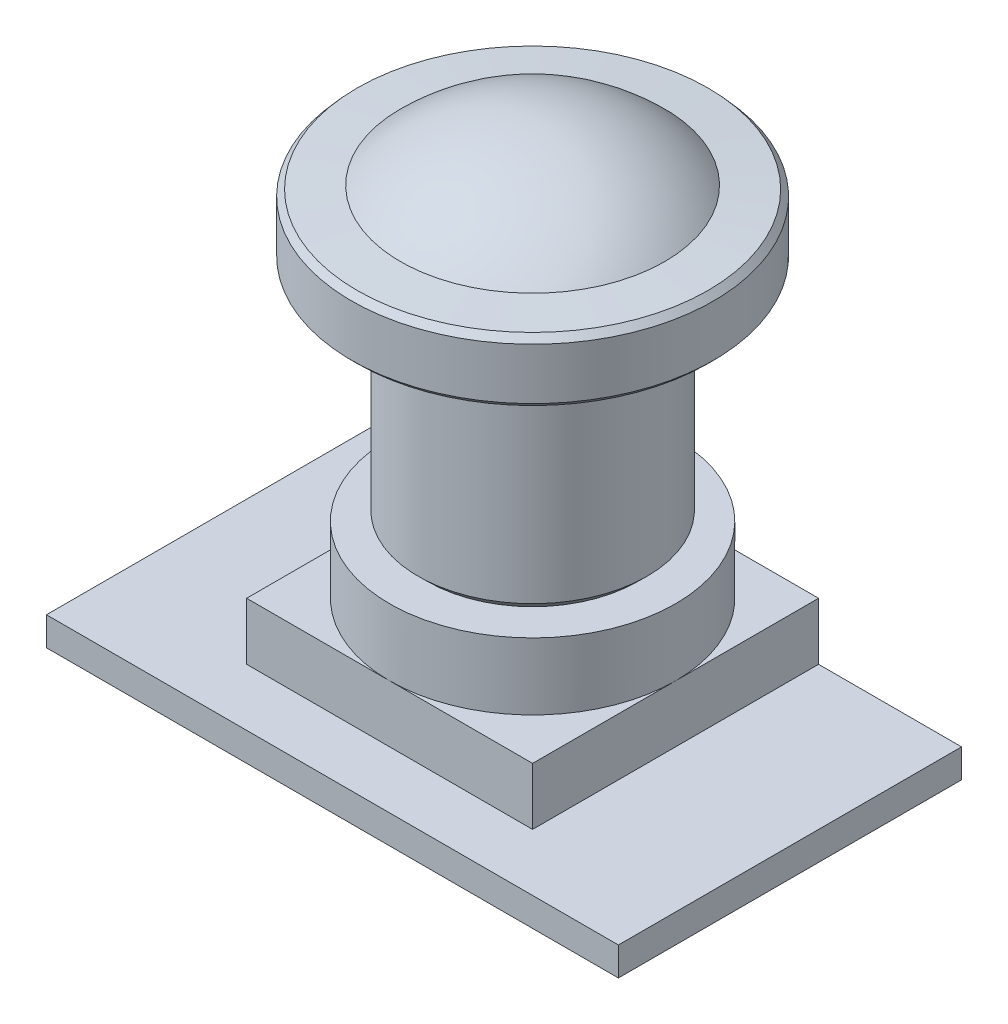
ISO-10303-21;
HEADER;
FILE_DESCRIPTION(('STEP AP214'),'2;1');
FILE_NAME('part.step','',(''),(''),'','','');
FILE_SCHEMA(('AUTOMOTIVE_DESIGN { 1 0 10303 214 1 1 1 1 }'));
ENDSEC;
DATA;
#1=APPLICATION_CONTEXT('core data for automotive mechanical design processes');
#2=APPLICATION_PROTOCOL_DEFINITION('international standard','automotive_design',2000,#1);
#3=PRODUCT_CONTEXT('',#1,'mechanical');
#4=PRODUCT('Part','Part','',(#3));
#5=PRODUCT_RELATED_PRODUCT_CATEGORY('part','',(#4));
#6=PRODUCT_DEFINITION_FORMATION('','',#4);
#7=PRODUCT_DEFINITION_CONTEXT('part definition',#1,'design');
#8=PRODUCT_DEFINITION('design','',#6,#7);
#9=PRODUCT_DEFINITION_SHAPE('','',#8);
#10=(LENGTH_UNIT() NAMED_UNIT(*) SI_UNIT(.MILLI.,.METRE.));
#11=(NAMED_UNIT(*) PLANE_ANGLE_UNIT() SI_UNIT($,.RADIAN.));
#12=(NAMED_UNIT(*) SI_UNIT($,.STERADIAN.) SOLID_ANGLE_UNIT());
#13=UNCERTAINTY_MEASURE_WITH_UNIT(LENGTH_MEASURE(1.E-05),#10,'distance_accuracy_value','');
#14=(GEOMETRIC_REPRESENTATION_CONTEXT(3) GLOBAL_UNCERTAINTY_ASSIGNED_CONTEXT((#13)) GLOBAL_UNIT_ASSIGNED_CONTEXT((#10,
#11,#12)) REPRESENTATION_CONTEXT('',''));
#15=CARTESIAN_POINT('',(0.,0.,0.));
#16=DIRECTION('',(0.,0.,1.));
#17=DIRECTION('',(1.,0.,0.));
#18=AXIS2_PLACEMENT_3D('',#15,#16,#17);
#19=CARTESIAN_POINT('',(35.5474240058328,37.250502123747,0.));
#20=DIRECTION('',(0.,0.,-1.));
#21=DIRECTION('',(-1.,0.,0.));
#22=AXIS2_PLACEMENT_3D('',#19,#20,#21);
#23=CIRCLE('',#22,9.85369395200336);
#24=TRIMMED_CURVE('',#23,(PARAMETER_VALUE(-1.57263969685922)),
(PARAMETER_VALUE(1.57263969685922)),.T.,.PARAMETER.);
#25=CARTESIAN_POINT('',(35.565588,37.250502123747,0.));
#26=DIRECTION('',(0.,1.,0.));
#27=AXIS1_PLACEMENT('',#25,#26);
#28=SURFACE_OF_REVOLUTION('',#24,#27);
#29=CARTESIAN_POINT('',(35.565588,44.2696144190769,0.));
#30=DIRECTION('',(0.,1.,0.));
#31=DIRECTION('',(-1.,0.,0.));
#32=AXIS2_PLACEMENT_3D('',#29,#30,#31);
#33=CIRCLE('',#32,6.9338958488082);
#34=CARTESIAN_POINT('',(28.6316921511918,44.2696144190769,0.));
#35=VERTEX_POINT('',#34);
#36=EDGE_CURVE('E13',#35,#35,#33,.T.);
#37=ORIENTED_EDGE('',*,*,#36,.T.);
#38=EDGE_LOOP('',(#37));
#39=FACE_BOUND('',#38,.T.);
#40=CARTESIAN_POINT('',(35.565588,47.1041793342641,0.));
#41=VERTEX_POINT('',#40);
#42=VERTEX_LOOP('',#41);
#43=FACE_BOUND('',#42,.T.);
#44=ADVANCED_FACE('F48',(#39,#43),#28,.T.);
#45=CARTESIAN_POINT('',(35.565588,44.2696144190769,0.));
#46=DIRECTION('',(0.,-1.,0.));
#47=DIRECTION('',(1.,0.,0.));
#48=AXIS2_PLACEMENT_3D('',#45,#46,#47);
#49=CONICAL_SURFACE('',#48,6.9338958488082,1.49234892329345);
#50=CARTESIAN_POINT('',(35.565588,44.0914150481524,0.));
#51=DIRECTION('',(0.,1.,0.));
#52=DIRECTION('',(-1.,0.,0.));
#53=AXIS2_PLACEMENT_3D('',#50,#51,#52);
#54=CIRCLE('',#53,9.2008118576038);
#55=CARTESIAN_POINT('',(26.3647761423962,44.0914150481524,0.));
#56=VERTEX_POINT('',#55);
#57=EDGE_CURVE('E56',#56,#56,#54,.T.);
#58=ORIENTED_EDGE('',*,*,#57,.T.);
#59=EDGE_LOOP('',(#58));
#60=FACE_BOUND('',#59,.T.);
#61=ORIENTED_EDGE('',*,*,#36,.F.);
#62=EDGE_LOOP('',(#61));
#63=FACE_BOUND('',#62,.T.);
#64=ADVANCED_FACE('F285',(#60,#63),#49,.T.);
#65=CARTESIAN_POINT('',(35.565588,44.0914150481524,0.));
#66=DIRECTION('',(0.,-1.,0.));
#67=DIRECTION('',(1.,0.,0.));
#68=AXIS2_PLACEMENT_3D('',#65,#66,#67);
#69=CONICAL_SURFACE('',#68,9.2008118576038,0.728628878942972);
#70=CARTESIAN_POINT('',(35.565588,43.7619038310705,0.));
#71=DIRECTION('',(0.,1.,0.));
#72=DIRECTION('',(-1.,0.,0.));
#73=AXIS2_PLACEMENT_3D('',#70,#71,#72);
#74=CIRCLE('',#73,9.49488458250059);
#75=CARTESIAN_POINT('',(26.0707034174994,43.7619038310705,0.));
#76=VERTEX_POINT('',#75);
#77=EDGE_CURVE('E253',#76,#76,#74,.T.);
#78=ORIENTED_EDGE('',*,*,#77,.T.);
#79=EDGE_LOOP('',(#78));
#80=FACE_BOUND('',#79,.T.);
#81=ORIENTED_EDGE('',*,*,#57,.F.);
#82=EDGE_LOOP('',(#81));
#83=FACE_BOUND('',#82,.T.);
#84=ADVANCED_FACE('F290',(#80,#83),#69,.T.);
#85=CARTESIAN_POINT('',(35.565588,47.1041793342641,0.));
#86=DIRECTION('',(0.,1.,0.));
#87=DIRECTION('',(-1.,0.,0.));
#88=AXIS2_PLACEMENT_3D('',#85,#86,#87);
#89=CYLINDRICAL_SURFACE('',#88,9.49488458250059);
#90=CARTESIAN_POINT('',(35.565588,41.066094867844,0.));
#91=DIRECTION('',(0.,1.,0.));
#92=DIRECTION('',(-1.,0.,0.));
#93=AXIS2_PLACEMENT_3D('',#90,#91,#92);
#94=CIRCLE('',#93,9.49488458250059);
#95=CARTESIAN_POINT('',(26.0707034174994,41.066094867844,0.));
#96=VERTEX_POINT('',#95);
#97=EDGE_CURVE('E250',#96,#96,#94,.T.);
#98=ORIENTED_EDGE('',*,*,#97,.T.);
#99=EDGE_LOOP('',(#98));
#100=FACE_BOUND('',#99,.T.);
#101=ORIENTED_EDGE('',*,*,#77,.F.);
#102=EDGE_LOOP('',(#101));
#103=FACE_BOUND('',#102,.T.);
#104=ADVANCED_FACE('F298',(#100,#103),#89,.T.);
#105=CARTESIAN_POINT('',(35.565588,41.066094867844,0.));
#106=DIRECTION('',(0.,1.,0.));
#107=DIRECTION('',(-1.,0.,0.));
#108=AXIS2_PLACEMENT_3D('',#105,#106,#107);
#109=CONICAL_SURFACE('',#108,9.49488458250059,0.784752126116818);
#110=CARTESIAN_POINT('',(35.565588,40.759804011379,0.));
#111=DIRECTION('',(0.,1.,0.));
#112=DIRECTION('',(-1.,0.,0.));
#113=AXIS2_PLACEMENT_3D('',#110,#111,#112);
#114=CIRCLE('',#113,9.18898922120997);
#115=CARTESIAN_POINT('',(26.37659877879,40.759804011379,0.));
#116=VERTEX_POINT('',#115);
#117=EDGE_CURVE('E247',#116,#116,#114,.T.);
#118=ORIENTED_EDGE('',*,*,#117,.T.);
#119=EDGE_LOOP('',(#118));
#120=FACE_BOUND('',#119,.T.);
#121=ORIENTED_EDGE('',*,*,#97,.F.);
#122=EDGE_LOOP('',(#121));
#123=FACE_BOUND('',#122,.T.);
#124=ADVANCED_FACE('F304',(#120,#123),#109,.T.);
#125=CARTESIAN_POINT('',(26.8236193205219,40.759804011379,0.));
#126=DIRECTION('',(0.,-1.,0.));
#127=DIRECTION('',(1.,0.,0.));
#128=AXIS2_PLACEMENT_3D('',#125,#126,#127);
#129=PLANE('',#128);
#130=CARTESIAN_POINT('',(35.565588,40.759804011379,0.));
#131=DIRECTION('',(0.,1.,0.));
#132=DIRECTION('',(-1.,0.,0.));
#133=AXIS2_PLACEMENT_3D('',#130,#131,#132);
#134=CIRCLE('',#133,5.49459784246738);
#135=CARTESIAN_POINT('',(30.0709901575326,40.759804011379,0.));
#136=VERTEX_POINT('',#135);
#137=EDGE_CURVE('E244',#136,#136,#134,.T.);
#138=ORIENTED_EDGE('',*,*,#137,.T.);
#139=EDGE_LOOP('',(#138));
#140=FACE_BOUND('',#139,.T.);
#141=ORIENTED_EDGE('',*,*,#117,.F.);
#142=EDGE_LOOP('',(#141));
#143=FACE_BOUND('',#142,.T.);
#144=ADVANCED_FACE('F308',(#140,#143),#129,.T.);
#145=CARTESIAN_POINT('',(35.565588,47.1041793342641,0.));
#146=DIRECTION('',(0.,1.,0.));
#147=DIRECTION('',(-1.,0.,0.));
#148=AXIS2_PLACEMENT_3D('',#145,#146,#147);
#149=CYLINDRICAL_SURFACE('',#148,5.49459784246738);
#150=CARTESIAN_POINT('',(35.565588,40.3124205238345,0.));
#151=DIRECTION('',(0.,1.,0.));
#152=DIRECTION('',(-1.,0.,0.));
#153=AXIS2_PLACEMENT_3D('',#150,#151,#152);
#154=CIRCLE('',#153,5.49459784246738);
#155=CARTESIAN_POINT('',(30.0709901575326,40.3124205238345,0.));
#156=VERTEX_POINT('',#155);
#157=EDGE_CURVE('E241',#156,#156,#154,.T.);
#158=ORIENTED_EDGE('',*,*,#157,.T.);
#159=EDGE_LOOP('',(#158));
#160=FACE_BOUND('',#159,.T.);
#161=ORIENTED_EDGE('',*,*,#137,.F.);
#162=EDGE_LOOP('',(#161));
#163=FACE_BOUND('',#162,.T.);
#164=ADVANCED_FACE('F312',(#160,#163),#149,.T.);
#165=CARTESIAN_POINT('',(29.8238329115065,40.3124205238345,0.));
#166=DIRECTION('',(0.,1.,0.));
#167=DIRECTION('',(-1.,0.,0.));
#168=AXIS2_PLACEMENT_3D('',#165,#166,#167);
#169=PLANE('',#168);
#170=CARTESIAN_POINT('',(35.565588,40.3124205238345,0.));
#171=DIRECTION('',(0.,1.,0.));
#172=DIRECTION('',(-1.,0.,0.));
#173=AXIS2_PLACEMENT_3D('',#170,#171,#172);
#174=CIRCLE('',#173,5.74175508849348);
#175=CARTESIAN_POINT('',(29.8238329115065,40.3124205238345,0.));
#176=VERTEX_POINT('',#175);
#177=EDGE_CURVE('E238',#176,#176,#174,.T.);
#178=ORIENTED_EDGE('',*,*,#177,.T.);
#179=EDGE_LOOP('',(#178));
#180=FACE_BOUND('',#179,.T.);
#181=ORIENTED_EDGE('',*,*,#157,.F.);
#182=EDGE_LOOP('',(#181));
#183=FACE_BOUND('',#182,.T.);
#184=ADVANCED_FACE('F316',(#180,#183),#169,.T.);
#185=CARTESIAN_POINT('',(35.565588,40.3124205238345,0.));
#186=DIRECTION('',(0.,-1.,0.));
#187=DIRECTION('',(1.,0.,0.));
#188=AXIS2_PLACEMENT_3D('',#185,#186,#187);
#189=CONICAL_SURFACE('',#188,5.74175508849348,0.808832423869016);
#190=CARTESIAN_POINT('',(35.565588,40.0653041347479,0.));
#191=DIRECTION('',(0.,1.,0.));
#192=DIRECTION('',(-1.,0.,0.));
#193=AXIS2_PLACEMENT_3D('',#190,#191,#192);
#194=CIRCLE('',#193,6.00073360901542);
#195=CARTESIAN_POINT('',(29.5648543909846,40.0653041347479,0.));
#196=VERTEX_POINT('',#195);
#197=EDGE_CURVE('E235',#196,#196,#194,.T.);
#198=ORIENTED_EDGE('',*,*,#197,.T.);
#199=EDGE_LOOP('',(#198));
#200=FACE_BOUND('',#199,.T.);
#201=ORIENTED_EDGE('',*,*,#177,.F.);
#202=EDGE_LOOP('',(#201));
#203=FACE_BOUND('',#202,.T.);
#204=ADVANCED_FACE('F320',(#200,#203),#189,.T.);
#205=CARTESIAN_POINT('',(35.565588,47.1041793342641,0.));
#206=DIRECTION('',(0.,1.,0.));
#207=DIRECTION('',(-1.,0.,0.));
#208=AXIS2_PLACEMENT_3D('',#205,#206,#207);
#209=CYLINDRICAL_SURFACE('',#208,6.00073360901542);
#210=CARTESIAN_POINT('',(35.565588,29.5056034073457,0.));
#211=DIRECTION('',(0.,1.,0.));
#212=DIRECTION('',(-1.,0.,0.));
#213=AXIS2_PLACEMENT_3D('',#210,#211,#212);
#214=CIRCLE('',#213,6.00073360901542);
#215=CARTESIAN_POINT('',(29.5648543909846,29.5056034073457,0.));
#216=VERTEX_POINT('',#215);
#217=EDGE_CURVE('E232',#216,#216,#214,.T.);
#218=ORIENTED_EDGE('',*,*,#217,.T.);
#219=EDGE_LOOP('',(#218));
#220=FACE_BOUND('',#219,.T.);
#221=ORIENTED_EDGE('',*,*,#197,.F.);
#222=EDGE_LOOP('',(#221));
#223=FACE_BOUND('',#222,.T.);
#224=ADVANCED_FACE('F324',(#220,#223),#209,.T.);
#225=CARTESIAN_POINT('',(35.565588,29.5056034073457,0.));
#226=DIRECTION('',(0.,1.,0.));
#227=DIRECTION('',(-1.,0.,0.));
#228=AXIS2_PLACEMENT_3D('',#225,#226,#227);
#229=CONICAL_SURFACE('',#228,6.00073360901542,0.797223208136891);
#230=CARTESIAN_POINT('',(35.565588,29.0112984485795,0.));
#231=DIRECTION('',(0.,-1.,0.));
#232=DIRECTION('',(1.,0.,0.));
#233=AXIS2_PLACEMENT_3D('',#230,#231,#232);
#234=CIRCLE('',#233,5.49459784246744);
#235=CARTESIAN_POINT('',(41.0601858424674,29.0112984485795,0.));
#236=VERTEX_POINT('',#235);
#237=EDGE_CURVE('E226',#236,#236,#234,.F.);
#238=ORIENTED_EDGE('',*,*,#237,.T.);
#239=EDGE_LOOP('',(#238));
#240=FACE_BOUND('',#239,.T.);
#241=ORIENTED_EDGE('',*,*,#217,.F.);
#242=EDGE_LOOP('',(#241));
#243=FACE_BOUND('',#242,.T.);
#244=ADVANCED_FACE('F328',(#240,#243),#229,.T.);
#245=CARTESIAN_POINT('',(35.565588,25.5112984485795,0.));
#246=DIRECTION('',(0.,1.,0.));
#247=DIRECTION('',(-1.,0.,0.));
#248=AXIS2_PLACEMENT_3D('',#245,#246,#247);
#249=CYLINDRICAL_SURFACE('',#248,7.5);
#250=CARTESIAN_POINT('',(35.565588,25.5112984485795,0.));
#251=DIRECTION('',(0.,-1.,0.));
#252=DIRECTION('',(1.,0.,0.));
#253=AXIS2_PLACEMENT_3D('',#250,#251,#252);
#254=CIRCLE('',#253,7.5);
#255=CARTESIAN_POINT('',(43.065588,25.5112984485795,0.));
#256=VERTEX_POINT('',#255);
#257=CARTESIAN_POINT('',(35.565588,25.5112984485795,7.5));
#258=VERTEX_POINT('',#257);
#259=EDGE_CURVE('E223',#256,#258,#254,.T.);
#260=ORIENTED_EDGE('',*,*,#259,.F.);
#261=CARTESIAN_POINT('',(35.565588,25.5112984485795,-7.5));
#262=VERTEX_POINT('',#261);
#263=EDGE_CURVE('E64',#262,#256,#254,.T.);
#264=ORIENTED_EDGE('',*,*,#263,.F.);
#265=CARTESIAN_POINT('',(28.065588,25.5112984485795,0.));
#266=VERTEX_POINT('',#265);
#267=EDGE_CURVE('E68',#266,#262,#254,.T.);
#268=ORIENTED_EDGE('',*,*,#267,.F.);
#269=EDGE_CURVE('E227',#258,#266,#254,.T.);
#270=ORIENTED_EDGE('',*,*,#269,.F.);
#271=EDGE_LOOP('',(#260,#264,#268,#270));
#272=FACE_BOUND('',#271,.T.);
#273=CARTESIAN_POINT('',(35.565588,29.0112984485795,0.));
#274=DIRECTION('',(0.,-1.,0.));
#275=DIRECTION('',(1.,0.,0.));
#276=AXIS2_PLACEMENT_3D('',#273,#274,#275);
#277=CIRCLE('',#276,7.5);
#278=CARTESIAN_POINT('',(43.065588,29.0112984485795,0.));
#279=VERTEX_POINT('',#278);
#280=EDGE_CURVE('E222',#279,#279,#277,.T.);
#281=ORIENTED_EDGE('',*,*,#280,.T.);
#282=EDGE_LOOP('',(#281));
#283=FACE_BOUND('',#282,.T.);
#284=ADVANCED_FACE('F332',(#272,#283),#249,.T.);
#285=CARTESIAN_POINT('',(35.565588,29.0112984485795,0.));
#286=DIRECTION('',(0.,-1.,0.));
#287=DIRECTION('',(1.,0.,0.));
#288=AXIS2_PLACEMENT_3D('',#285,#286,#287);
#289=PLANE('',#288);
#290=ORIENTED_EDGE('',*,*,#237,.F.);
#291=EDGE_LOOP('',(#290));
#292=FACE_BOUND('',#291,.T.);
#293=ORIENTED_EDGE('',*,*,#280,.F.);
#294=EDGE_LOOP('',(#293));
#295=FACE_BOUND('',#294,.T.);
#296=ADVANCED_FACE('F336',(#292,#295),#289,.F.);
#297=CARTESIAN_POINT('',(0.,25.5112984485795,0.));
#298=DIRECTION('',(0.,-1.,0.));
#299=DIRECTION('',(0.,0.,-1.));
#300=AXIS2_PLACEMENT_3D('',#297,#298,#299);
#301=PLANE('',#300);
#302=DIRECTION('',(0.,0.,1.));
#303=VECTOR('',#302,1.);
#304=CARTESIAN_POINT('',(43.065588,25.5112984485795,7.5));
#305=LINE('',#304,#303);
#306=CARTESIAN_POINT('',(43.065588,25.5112984485795,7.5));
#307=VERTEX_POINT('',#306);
#308=EDGE_CURVE('E152',#256,#307,#305,.T.);
#309=ORIENTED_EDGE('',*,*,#308,.F.);
#310=ORIENTED_EDGE('',*,*,#259,.T.);
#311=DIRECTION('',(-1.,0.,0.));
#312=VECTOR('',#311,1.);
#313=CARTESIAN_POINT('',(28.065588,25.5112984485795,7.5));
#314=LINE('',#313,#312);
#315=EDGE_CURVE('E207',#307,#258,#314,.T.);
#316=ORIENTED_EDGE('',*,*,#315,.F.);
#317=EDGE_LOOP('',(#309,#310,#316));
#318=FACE_BOUND('',#317,.T.);
#319=ADVANCED_FACE('F339',(#318),#301,.F.);
#320=CARTESIAN_POINT('',(28.065588,25.5112984485795,7.5));
#321=VERTEX_POINT('',#320);
#322=EDGE_CURVE('E206',#258,#321,#314,.T.);
#323=ORIENTED_EDGE('',*,*,#322,.F.);
#324=ORIENTED_EDGE('',*,*,#269,.T.);
#325=DIRECTION('',(0.,0.,-1.));
#326=VECTOR('',#325,1.);
#327=CARTESIAN_POINT('',(28.065588,25.5112984485795,7.5));
#328=LINE('',#327,#326);
#329=EDGE_CURVE('E211',#321,#266,#328,.T.);
#330=ORIENTED_EDGE('',*,*,#329,.F.);
#331=EDGE_LOOP('',(#323,#324,#330));
#332=FACE_BOUND('',#331,.T.);
#333=ADVANCED_FACE('F354',(#332),#301,.F.);
#334=CARTESIAN_POINT('',(28.065588,25.5112984485795,-7.5));
#335=VERTEX_POINT('',#334);
#336=EDGE_CURVE('E210',#266,#335,#328,.T.);
#337=ORIENTED_EDGE('',*,*,#336,.F.);
#338=ORIENTED_EDGE('',*,*,#267,.T.);
#339=DIRECTION('',(1.,0.,0.));
#340=VECTOR('',#339,1.);
#341=CARTESIAN_POINT('',(28.065588,25.5112984485795,-7.5));
#342=LINE('',#341,#340);
#343=EDGE_CURVE('E215',#335,#262,#342,.T.);
#344=ORIENTED_EDGE('',*,*,#343,.F.);
#345=EDGE_LOOP('',(#337,#338,#344));
#346=FACE_BOUND('',#345,.T.);
#347=ADVANCED_FACE('F260',(#346),#301,.F.);
#348=CARTESIAN_POINT('',(43.065588,25.5112984485795,-7.5));
#349=VERTEX_POINT('',#348);
#350=EDGE_CURVE('E214',#262,#349,#342,.T.);
#351=ORIENTED_EDGE('',*,*,#350,.F.);
#352=ORIENTED_EDGE('',*,*,#263,.T.);
#353=EDGE_CURVE('E154',#349,#256,#305,.T.);
#354=ORIENTED_EDGE('',*,*,#353,.F.);
#355=EDGE_LOOP('',(#351,#352,#354));
#356=FACE_BOUND('',#355,.T.);
#357=ADVANCED_FACE('F264',(#356),#301,.F.);
#358=CARTESIAN_POINT('',(43.065588,22.5112984485795,7.5));
#359=DIRECTION('',(-1.,0.,0.));
#360=DIRECTION('',(0.,-1.,0.));
#361=AXIS2_PLACEMENT_3D('',#358,#359,#360);
#362=PLANE('',#361);
#363=ORIENTED_EDGE('',*,*,#353,.T.);
#364=ORIENTED_EDGE('',*,*,#308,.T.);
#365=DIRECTION('',(0.,1.,0.));
#366=VECTOR('',#365,1.);
#367=CARTESIAN_POINT('',(43.065588,22.5112984485795,7.5));
#368=LINE('',#367,#366);
#369=CARTESIAN_POINT('',(43.065588,22.5112984485795,7.5));
#370=VERTEX_POINT('',#369);
#371=EDGE_CURVE('E219',#370,#307,#368,.T.);
#372=ORIENTED_EDGE('',*,*,#371,.F.);
#373=DIRECTION('',(0.,0.,1.));
#374=VECTOR('',#373,1.);
#375=CARTESIAN_POINT('',(43.065588,22.5112984485795,7.5));
#376=LINE('',#375,#374);
#377=CARTESIAN_POINT('',(43.065588,22.5112984485795,-7.5));
#378=VERTEX_POINT('',#377);
#379=EDGE_CURVE('E197',#378,#370,#376,.T.);
#380=ORIENTED_EDGE('',*,*,#379,.F.);
#381=DIRECTION('',(0.,1.,0.));
#382=VECTOR('',#381,1.);
#383=CARTESIAN_POINT('',(43.065588,22.5112984485795,-7.5));
#384=LINE('',#383,#382);
#385=EDGE_CURVE('E192',#378,#349,#384,.T.);
#386=ORIENTED_EDGE('',*,*,#385,.T.);
#387=EDGE_LOOP('',(#363,#364,#372,#380,#386));
#388=FACE_BOUND('',#387,.T.);
#389=ADVANCED_FACE('F268',(#388),#362,.F.);
#390=CARTESIAN_POINT('',(28.065588,22.5112984485795,7.5));
#391=DIRECTION('',(0.,0.,-1.));
#392=DIRECTION('',(-1.,0.,0.));
#393=AXIS2_PLACEMENT_3D('',#390,#391,#392);
#394=PLANE('',#393);
#395=ORIENTED_EDGE('',*,*,#315,.T.);
#396=ORIENTED_EDGE('',*,*,#322,.T.);
#397=DIRECTION('',(0.,1.,0.));
#398=VECTOR('',#397,1.);
#399=CARTESIAN_POINT('',(28.065588,22.5112984485795,7.5));
#400=LINE('',#399,#398);
#401=CARTESIAN_POINT('',(28.065588,22.5112984485795,7.5));
#402=VERTEX_POINT('',#401);
#403=EDGE_CURVE('E217',#402,#321,#400,.T.);
#404=ORIENTED_EDGE('',*,*,#403,.F.);
#405=DIRECTION('',(-1.,0.,0.));
#406=VECTOR('',#405,1.);
#407=CARTESIAN_POINT('',(28.065588,22.5112984485795,7.5));
#408=LINE('',#407,#406);
#409=EDGE_CURVE('E189',#370,#402,#408,.T.);
#410=ORIENTED_EDGE('',*,*,#409,.F.);
#411=ORIENTED_EDGE('',*,*,#371,.T.);
#412=EDGE_LOOP('',(#395,#396,#404,#410,#411));
#413=FACE_BOUND('',#412,.T.);
#414=ADVANCED_FACE('F343',(#413),#394,.F.);
#415=CARTESIAN_POINT('',(28.065588,22.5112984485795,7.5));
#416=DIRECTION('',(1.,0.,0.));
#417=DIRECTION('',(0.,1.,0.));
#418=AXIS2_PLACEMENT_3D('',#415,#416,#417);
#419=PLANE('',#418);
#420=ORIENTED_EDGE('',*,*,#329,.T.);
#421=ORIENTED_EDGE('',*,*,#336,.T.);
#422=DIRECTION('',(0.,1.,0.));
#423=VECTOR('',#422,1.);
#424=CARTESIAN_POINT('',(28.065588,22.5112984485795,-7.5));
#425=LINE('',#424,#423);
#426=CARTESIAN_POINT('',(28.065588,22.5112984485795,-7.5));
#427=VERTEX_POINT('',#426);
#428=EDGE_CURVE('E195',#427,#335,#425,.T.);
#429=ORIENTED_EDGE('',*,*,#428,.F.);
#430=DIRECTION('',(0.,0.,-1.));
#431=VECTOR('',#430,1.);
#432=CARTESIAN_POINT('',(28.065588,22.5112984485795,7.5));
#433=LINE('',#432,#431);
#434=EDGE_CURVE('E187',#402,#427,#433,.T.);
#435=ORIENTED_EDGE('',*,*,#434,.F.);
#436=ORIENTED_EDGE('',*,*,#403,.T.);
#437=EDGE_LOOP('',(#420,#421,#429,#435,#436));
#438=FACE_BOUND('',#437,.T.);
#439=ADVANCED_FACE('F346',(#438),#419,.F.);
#440=CARTESIAN_POINT('',(28.065588,22.5112984485795,-7.5));
#441=DIRECTION('',(0.,0.,1.));
#442=DIRECTION('',(1.,0.,0.));
#443=AXIS2_PLACEMENT_3D('',#440,#441,#442);
#444=PLANE('',#443);
#445=ORIENTED_EDGE('',*,*,#343,.T.);
#446=ORIENTED_EDGE('',*,*,#350,.T.);
#447=ORIENTED_EDGE('',*,*,#385,.F.);
#448=DIRECTION('',(1.,0.,0.));
#449=VECTOR('',#448,1.);
#450=CARTESIAN_POINT('',(50.565588,22.5112984485795,-7.5));
#451=LINE('',#450,#449);
#452=CARTESIAN_POINT('',(50.565588,22.5112984485795,-7.5));
#453=VERTEX_POINT('',#452);
#454=EDGE_CURVE('E163',#378,#453,#451,.T.);
#455=ORIENTED_EDGE('',*,*,#454,.T.);
#456=DIRECTION('',(0.,1.,0.));
#457=VECTOR('',#456,1.);
#458=CARTESIAN_POINT('',(50.565588,21.0112984485795,-7.5));
#459=LINE('',#458,#457);
#460=CARTESIAN_POINT('',(50.565588,21.0112984485795,-7.5));
#461=VERTEX_POINT('',#460);
#462=EDGE_CURVE('E170',#461,#453,#459,.T.);
#463=ORIENTED_EDGE('',*,*,#462,.F.);
#464=DIRECTION('',(1.,0.,0.));
#465=VECTOR('',#464,1.);
#466=CARTESIAN_POINT('',(50.565588,21.0112984485795,-7.5));
#467=LINE('',#466,#465);
#468=CARTESIAN_POINT('',(20.565588,21.0112984485795,-7.5));
#469=VERTEX_POINT('',#468);
#470=EDGE_CURVE('E143',#469,#461,#467,.T.);
#471=ORIENTED_EDGE('',*,*,#470,.F.);
#472=DIRECTION('',(0.,1.,0.));
#473=VECTOR('',#472,1.);
#474=CARTESIAN_POINT('',(20.565588,21.0112984485795,-7.5));
#475=LINE('',#474,#473);
#476=CARTESIAN_POINT('',(20.565588,22.5112984485795,-7.5));
#477=VERTEX_POINT('',#476);
#478=EDGE_CURVE('E156',#469,#477,#475,.T.);
#479=ORIENTED_EDGE('',*,*,#478,.T.);
#480=EDGE_CURVE('E147',#477,#427,#451,.T.);
#481=ORIENTED_EDGE('',*,*,#480,.T.);
#482=ORIENTED_EDGE('',*,*,#428,.T.);
#483=EDGE_LOOP('',(#445,#446,#447,#455,#463,#471,#479,#481,#482));
#484=FACE_BOUND('',#483,.T.);
#485=ADVANCED_FACE('F177',(#484),#444,.F.);
#486=CARTESIAN_POINT('',(0.,22.5112984485795,0.));
#487=DIRECTION('',(0.,-1.,0.));
#488=DIRECTION('',(0.,0.,-1.));
#489=AXIS2_PLACEMENT_3D('',#486,#487,#488);
#490=PLANE('',#489);
#491=ORIENTED_EDGE('',*,*,#454,.F.);
#492=ORIENTED_EDGE('',*,*,#379,.T.);
#493=ORIENTED_EDGE('',*,*,#409,.T.);
#494=ORIENTED_EDGE('',*,*,#434,.T.);
#495=ORIENTED_EDGE('',*,*,#480,.F.);
#496=DIRECTION('',(0.,0.,-1.));
#497=VECTOR('',#496,1.);
#498=CARTESIAN_POINT('',(20.565588,22.5112984485795,-7.5));
#499=LINE('',#498,#497);
#500=CARTESIAN_POINT('',(20.565588,22.5112984485795,10.5));
#501=VERTEX_POINT('',#500);
#502=EDGE_CURVE('E168',#501,#477,#499,.T.);
#503=ORIENTED_EDGE('',*,*,#502,.F.);
#504=DIRECTION('',(-1.,0.,0.));
#505=VECTOR('',#504,1.);
#506=CARTESIAN_POINT('',(50.565588,22.5112984485795,10.5));
#507=LINE('',#506,#505);
#508=CARTESIAN_POINT('',(50.565588,22.5112984485795,10.5));
#509=VERTEX_POINT('',#508);
#510=EDGE_CURVE('E270',#509,#501,#507,.T.);
#511=ORIENTED_EDGE('',*,*,#510,.F.);
#512=DIRECTION('',(0.,0.,1.));
#513=VECTOR('',#512,1.);
#514=CARTESIAN_POINT('',(50.565588,22.5112984485795,-7.5));
#515=LINE('',#514,#513);
#516=EDGE_CURVE('E151',#453,#509,#515,.T.);
#517=ORIENTED_EDGE('',*,*,#516,.F.);
#518=EDGE_LOOP('',(#491,#492,#493,#494,#495,#503,#511,#517));
#519=FACE_BOUND('',#518,.T.);
#520=ADVANCED_FACE('F184',(#519),#490,.F.);
#521=CARTESIAN_POINT('',(50.565588,21.0112984485795,-7.5));
#522=DIRECTION('',(-1.,0.,0.));
#523=DIRECTION('',(0.,0.,1.));
#524=AXIS2_PLACEMENT_3D('',#521,#522,#523);
#525=PLANE('',#524);
#526=ORIENTED_EDGE('',*,*,#516,.T.);
#527=DIRECTION('',(0.,1.,0.));
#528=VECTOR('',#527,1.);
#529=CARTESIAN_POINT('',(50.565588,21.0112984485795,10.5));
#530=LINE('',#529,#528);
#531=CARTESIAN_POINT('',(50.565588,21.0112984485795,10.5));
#532=VERTEX_POINT('',#531);
#533=EDGE_CURVE('E131',#532,#509,#530,.T.);
#534=ORIENTED_EDGE('',*,*,#533,.F.);
#535=DIRECTION('',(0.,0.,1.));
#536=VECTOR('',#535,1.);
#537=CARTESIAN_POINT('',(50.565588,21.0112984485795,-7.5));
#538=LINE('',#537,#536);
#539=EDGE_CURVE('E138',#461,#532,#538,.T.);
#540=ORIENTED_EDGE('',*,*,#539,.F.);
#541=ORIENTED_EDGE('',*,*,#462,.T.);
#542=EDGE_LOOP('',(#526,#534,#540,#541));
#543=FACE_BOUND('',#542,.T.);
#544=ADVANCED_FACE('F149',(#543),#525,.F.);
#545=CARTESIAN_POINT('',(50.565588,21.0112984485795,10.5));
#546=DIRECTION('',(0.,0.,-1.));
#547=DIRECTION('',(-1.,0.,0.));
#548=AXIS2_PLACEMENT_3D('',#545,#546,#547);
#549=PLANE('',#548);
#550=ORIENTED_EDGE('',*,*,#510,.T.);
#551=DIRECTION('',(0.,1.,0.));
#552=VECTOR('',#551,1.);
#553=CARTESIAN_POINT('',(20.565588,21.0112984485795,10.5));
#554=LINE('',#553,#552);
#555=CARTESIAN_POINT('',(20.565588,21.0112984485795,10.5));
#556=VERTEX_POINT('',#555);
#557=EDGE_CURVE('E134',#556,#501,#554,.T.);
#558=ORIENTED_EDGE('',*,*,#557,.F.);
#559=DIRECTION('',(-1.,0.,0.));
#560=VECTOR('',#559,1.);
#561=CARTESIAN_POINT('',(50.565588,21.0112984485795,10.5));
#562=LINE('',#561,#560);
#563=EDGE_CURVE('E127',#532,#556,#562,.T.);
#564=ORIENTED_EDGE('',*,*,#563,.F.);
#565=ORIENTED_EDGE('',*,*,#533,.T.);
#566=EDGE_LOOP('',(#550,#558,#564,#565));
#567=FACE_BOUND('',#566,.T.);
#568=ADVANCED_FACE('F129',(#567),#549,.F.);
#569=CARTESIAN_POINT('',(20.565588,21.0112984485795,-7.5));
#570=DIRECTION('',(1.,0.,0.));
#571=DIRECTION('',(0.,0.,-1.));
#572=AXIS2_PLACEMENT_3D('',#569,#570,#571);
#573=PLANE('',#572);
#574=ORIENTED_EDGE('',*,*,#502,.T.);
#575=ORIENTED_EDGE('',*,*,#478,.F.);
#576=DIRECTION('',(0.,0.,-1.));
#577=VECTOR('',#576,1.);
#578=CARTESIAN_POINT('',(20.565588,21.0112984485795,-7.5));
#579=LINE('',#578,#577);
#580=EDGE_CURVE('E137',#556,#469,#579,.T.);
#581=ORIENTED_EDGE('',*,*,#580,.F.);
#582=ORIENTED_EDGE('',*,*,#557,.T.);
#583=EDGE_LOOP('',(#574,#575,#581,#582));
#584=FACE_BOUND('',#583,.T.);
#585=ADVANCED_FACE('F274',(#584),#573,.F.);
#586=CARTESIAN_POINT('',(0.,21.0112984485795,0.));
#587=DIRECTION('',(0.,-1.,0.));
#588=DIRECTION('',(0.,0.,-1.));
#589=AXIS2_PLACEMENT_3D('',#586,#587,#588);
#590=PLANE('',#589);
#591=ORIENTED_EDGE('',*,*,#539,.T.);
#592=ORIENTED_EDGE('',*,*,#563,.T.);
#593=ORIENTED_EDGE('',*,*,#580,.T.);
#594=ORIENTED_EDGE('',*,*,#470,.T.);
#595=EDGE_LOOP('',(#591,#592,#593,#594));
#596=FACE_BOUND('',#595,.T.);
#597=ADVANCED_FACE('F141',(#596),#590,.T.);
#598=CLOSED_SHELL('',(#44,#64,#84,#104,#124,#144,#164,#184,#204,#224,#244,#284,#296,#319,#333,
#347,#357,#389,#414,#439,#485,#520,#544,#568,#585,#597));
#599=MANIFOLD_SOLID_BREP('B2',#598);
#600=ADVANCED_BREP_SHAPE_REPRESENTATION('',(#18,#599),#14);
#601=SHAPE_DEFINITION_REPRESENTATION(#9,#600);
ENDSEC;
END-ISO-10303-21;
